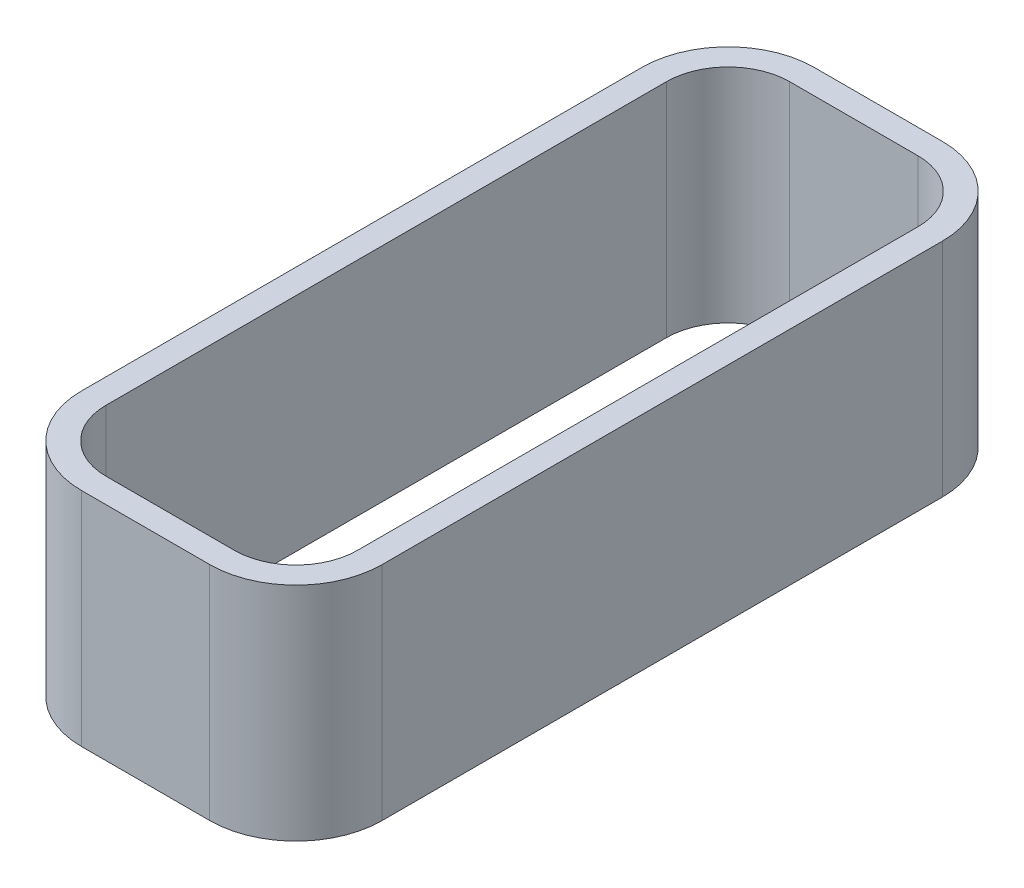
ISO-10303-21;
HEADER;
FILE_DESCRIPTION(('STEP AP214'),'2;1');
FILE_NAME('part.step','',(''),(''),'','','');
FILE_SCHEMA(('AUTOMOTIVE_DESIGN { 1 0 10303 214 1 1 1 1 }'));
ENDSEC;
DATA;
#1=APPLICATION_CONTEXT('core data for automotive mechanical design processes');
#2=APPLICATION_PROTOCOL_DEFINITION('international standard','automotive_design',2000,#1);
#3=PRODUCT_CONTEXT('',#1,'mechanical');
#4=PRODUCT('Part','Part','',(#3));
#5=PRODUCT_RELATED_PRODUCT_CATEGORY('part','',(#4));
#6=PRODUCT_DEFINITION_FORMATION('','',#4);
#7=PRODUCT_DEFINITION_CONTEXT('part definition',#1,'design');
#8=PRODUCT_DEFINITION('design','',#6,#7);
#9=PRODUCT_DEFINITION_SHAPE('','',#8);
#10=(LENGTH_UNIT() NAMED_UNIT(*) SI_UNIT(.MILLI.,.METRE.));
#11=(NAMED_UNIT(*) PLANE_ANGLE_UNIT() SI_UNIT($,.RADIAN.));
#12=(NAMED_UNIT(*) SI_UNIT($,.STERADIAN.) SOLID_ANGLE_UNIT());
#13=UNCERTAINTY_MEASURE_WITH_UNIT(LENGTH_MEASURE(1.E-05),#10,'distance_accuracy_value','');
#14=(GEOMETRIC_REPRESENTATION_CONTEXT(3) GLOBAL_UNCERTAINTY_ASSIGNED_CONTEXT((#13)) GLOBAL_UNIT_ASSIGNED_CONTEXT((#10,
#11,#12)) REPRESENTATION_CONTEXT('',''));
#15=CARTESIAN_POINT('',(0.,0.,0.));
#16=DIRECTION('',(0.,0.,1.));
#17=DIRECTION('',(1.,0.,0.));
#18=AXIS2_PLACEMENT_3D('',#15,#16,#17);
#19=CARTESIAN_POINT('',(-141.634040632791,2.4479314652041,-57.7658469617489));
#20=DIRECTION('',(-1.,0.,0.));
#21=DIRECTION('',(0.,0.,1.));
#22=AXIS2_PLACEMENT_3D('',#19,#20,#21);
#23=PLANE('',#22);
#24=DIRECTION('',(0.,0.,-1.));
#25=VECTOR('',#24,1.);
#26=CARTESIAN_POINT('',(-141.634040632791,-2.5520685347959,-58.7658469617489));
#27=LINE('',#26,#25);
#28=CARTESIAN_POINT('',(-141.634040632791,-2.5520685347959,-57.7658469617489));
#29=VERTEX_POINT('',#28);
#30=CARTESIAN_POINT('',(-141.634040632791,-2.5520685347959,-59.7658469617489));
#31=VERTEX_POINT('',#30);
#32=EDGE_CURVE('E258',#29,#31,#27,.T.);
#33=ORIENTED_EDGE('',*,*,#32,.F.);
#34=DIRECTION('',(0.,1.,0.));
#35=VECTOR('',#34,1.);
#36=CARTESIAN_POINT('',(-141.634040632791,2.4479314652041,-57.7658469617489));
#37=LINE('',#36,#35);
#38=CARTESIAN_POINT('',(-141.634040632791,-1.12418275469426,-57.7658469617489));
#39=VERTEX_POINT('',#38);
#40=EDGE_CURVE('E266',#39,#29,#37,.F.);
#41=ORIENTED_EDGE('',*,*,#40,.F.);
#42=DIRECTION('',(0.,0.,1.));
#43=VECTOR('',#42,1.);
#44=CARTESIAN_POINT('',(-141.634040632791,-1.12418275469427,-48.6733225165738));
#45=LINE('',#44,#43);
#46=CARTESIAN_POINT('',(-141.634040632791,-1.12418275469426,-59.7658469617489));
#47=VERTEX_POINT('',#46);
#48=EDGE_CURVE('E237',#39,#47,#45,.F.);
#49=ORIENTED_EDGE('',*,*,#48,.T.);
#50=DIRECTION('',(0.,1.,0.));
#51=VECTOR('',#50,1.);
#52=CARTESIAN_POINT('',(-141.634040632791,2.4479314652041,-59.7658469617489));
#53=LINE('',#52,#51);
#54=EDGE_CURVE('E252',#31,#47,#53,.T.);
#55=ORIENTED_EDGE('',*,*,#54,.F.);
#56=EDGE_LOOP('',(#33,#41,#49,#55));
#57=FACE_BOUND('',#56,.T.);
#58=ADVANCED_FACE('F17',(#57),#23,.T.);
#59=CARTESIAN_POINT('',(-141.634040632791,2.4479314652041,-48.6733225165738));
#60=DIRECTION('',(-1.,0.,0.));
#61=DIRECTION('',(0.,0.,1.));
#62=AXIS2_PLACEMENT_3D('',#59,#60,#61);
#63=PLANE('',#62);
#64=DIRECTION('',(0.,0.,-1.));
#65=VECTOR('',#64,1.);
#66=CARTESIAN_POINT('',(-141.634040632791,-2.5520685347959,-49.6733225165739));
#67=LINE('',#66,#65);
#68=CARTESIAN_POINT('',(-141.634040632791,-2.5520685347959,-48.6733225165738));
#69=VERTEX_POINT('',#68);
#70=CARTESIAN_POINT('',(-141.634040632791,-2.5520685347959,-50.6733225165738));
#71=VERTEX_POINT('',#70);
#72=EDGE_CURVE('E272',#69,#71,#67,.T.);
#73=ORIENTED_EDGE('',*,*,#72,.F.);
#74=DIRECTION('',(0.,1.,0.));
#75=VECTOR('',#74,1.);
#76=CARTESIAN_POINT('',(-141.634040632791,2.4479314652041,-48.6733225165738));
#77=LINE('',#76,#75);
#78=CARTESIAN_POINT('',(-141.634040632791,-1.12418275469426,-48.6733225165738));
#79=VERTEX_POINT('',#78);
#80=EDGE_CURVE('E284',#79,#69,#77,.F.);
#81=ORIENTED_EDGE('',*,*,#80,.F.);
#82=DIRECTION('',(0.,0.,1.));
#83=VECTOR('',#82,1.);
#84=CARTESIAN_POINT('',(-141.634040632791,-1.12418275469427,-48.6733225165738));
#85=LINE('',#84,#83);
#86=CARTESIAN_POINT('',(-141.634040632791,-1.12418275469426,-50.6733225165738));
#87=VERTEX_POINT('',#86);
#88=EDGE_CURVE('E208',#79,#87,#85,.F.);
#89=ORIENTED_EDGE('',*,*,#88,.T.);
#90=DIRECTION('',(0.,1.,0.));
#91=VECTOR('',#90,1.);
#92=CARTESIAN_POINT('',(-141.634040632791,2.4479314652041,-50.6733225165738));
#93=LINE('',#92,#91);
#94=EDGE_CURVE('E275',#71,#87,#93,.T.);
#95=ORIENTED_EDGE('',*,*,#94,.F.);
#96=EDGE_LOOP('',(#73,#81,#89,#95));
#97=FACE_BOUND('',#96,.T.);
#98=ADVANCED_FACE('F483',(#97),#63,.T.);
#99=CARTESIAN_POINT('',(-139.834040632791,2.4479314652041,-48.6733225165738));
#100=DIRECTION('',(0.,0.,1.));
#101=DIRECTION('',(1.,0.,0.));
#102=AXIS2_PLACEMENT_3D('',#99,#100,#101);
#103=PLANE('',#102);
#104=DIRECTION('',(1.,0.,0.));
#105=VECTOR('',#104,1.);
#106=CARTESIAN_POINT('',(-140.734040632791,-2.5520685347959,-48.6733225165738));
#107=LINE('',#106,#105);
#108=CARTESIAN_POINT('',(-139.834040602988,-2.5520685347959,-48.6733225165738));
#109=VERTEX_POINT('',#108);
#110=EDGE_CURVE('E278',#109,#69,#107,.F.);
#111=ORIENTED_EDGE('',*,*,#110,.F.);
#112=DIRECTION('',(0.,1.,0.));
#113=VECTOR('',#112,1.);
#114=CARTESIAN_POINT('',(-139.834040602988,-15.5520685347959,-48.6733225165738));
#115=LINE('',#114,#113);
#116=CARTESIAN_POINT('',(-139.83404062534,2.44793146520408,-48.6733225165738));
#117=VERTEX_POINT('',#116);
#118=EDGE_CURVE('E192',#117,#109,#115,.F.);
#119=ORIENTED_EDGE('',*,*,#118,.F.);
#120=DIRECTION('',(0.449999999999999,0.893028554974588,0.));
#121=VECTOR('',#120,1.);
#122=CARTESIAN_POINT('',(-139.834040632791,2.4479314652041,-48.6733225165738));
#123=LINE('',#122,#121);
#124=EDGE_CURVE('E202',#117,#79,#123,.F.);
#125=ORIENTED_EDGE('',*,*,#124,.T.);
#126=ORIENTED_EDGE('',*,*,#80,.T.);
#127=EDGE_LOOP('',(#111,#119,#125,#126));
#128=FACE_BOUND('',#127,.T.);
#129=ADVANCED_FACE('F488',(#128),#103,.T.);
#130=CARTESIAN_POINT('',(-140.734040632791,-2.5520685347959,-49.6733225165739));
#131=DIRECTION('',(0.,-1.,0.));
#132=DIRECTION('',(0.,0.,-1.));
#133=AXIS2_PLACEMENT_3D('',#130,#131,#132);
#134=PLANE('',#133);
#135=ORIENTED_EDGE('',*,*,#72,.T.);
#136=DIRECTION('',(-1.,0.,0.));
#137=VECTOR('',#136,1.);
#138=CARTESIAN_POINT('',(-141.634040632791,-2.5520685347959,-50.6733225165738));
#139=LINE('',#138,#137);
#140=CARTESIAN_POINT('',(-139.834040602988,-2.5520685347959,-50.6733225165738));
#141=VERTEX_POINT('',#140);
#142=EDGE_CURVE('E267',#141,#71,#139,.T.);
#143=ORIENTED_EDGE('',*,*,#142,.F.);
#144=DIRECTION('',(0.,0.,1.));
#145=VECTOR('',#144,1.);
#146=CARTESIAN_POINT('',(-139.834040602988,-2.5520685347959,-76.5168251656243));
#147=LINE('',#146,#145);
#148=EDGE_CURVE('E191',#109,#141,#147,.F.);
#149=ORIENTED_EDGE('',*,*,#148,.F.);
#150=ORIENTED_EDGE('',*,*,#110,.T.);
#151=EDGE_LOOP('',(#135,#143,#149,#150));
#152=FACE_BOUND('',#151,.T.);
#153=ADVANCED_FACE('F559',(#152),#134,.T.);
#154=CARTESIAN_POINT('',(-141.634040632791,2.4479314652041,-50.6733225165738));
#155=DIRECTION('',(0.,0.,-1.));
#156=DIRECTION('',(-1.,0.,0.));
#157=AXIS2_PLACEMENT_3D('',#154,#155,#156);
#158=PLANE('',#157);
#159=ORIENTED_EDGE('',*,*,#142,.T.);
#160=ORIENTED_EDGE('',*,*,#94,.T.);
#161=DIRECTION('',(0.449999999999999,0.893028554974588,0.));
#162=VECTOR('',#161,1.);
#163=CARTESIAN_POINT('',(-139.834040632791,2.4479314652041,-50.6733225165738));
#164=LINE('',#163,#162);
#165=CARTESIAN_POINT('',(-139.83404062534,2.44793146520409,-50.6733225165738));
#166=VERTEX_POINT('',#165);
#167=EDGE_CURVE('E193',#87,#166,#164,.T.);
#168=ORIENTED_EDGE('',*,*,#167,.T.);
#169=DIRECTION('',(0.,1.,0.));
#170=VECTOR('',#169,1.);
#171=CARTESIAN_POINT('',(-139.834040602988,-15.5520685347959,-50.6733225165738));
#172=LINE('',#171,#170);
#173=EDGE_CURVE('E222',#141,#166,#172,.T.);
#174=ORIENTED_EDGE('',*,*,#173,.F.);
#175=EDGE_LOOP('',(#159,#160,#168,#174));
#176=FACE_BOUND('',#175,.T.);
#177=ADVANCED_FACE('F454',(#176),#158,.T.);
#178=CARTESIAN_POINT('',(-139.834040632791,2.4479314652041,-57.7658469617489));
#179=DIRECTION('',(0.,0.,1.));
#180=DIRECTION('',(1.,0.,0.));
#181=AXIS2_PLACEMENT_3D('',#178,#179,#180);
#182=PLANE('',#181);
#183=DIRECTION('',(1.,0.,0.));
#184=VECTOR('',#183,1.);
#185=CARTESIAN_POINT('',(-140.734040632791,-2.5520685347959,-57.7658469617489));
#186=LINE('',#185,#184);
#187=CARTESIAN_POINT('',(-139.834040602988,-2.5520685347959,-57.7658469617489));
#188=VERTEX_POINT('',#187);
#189=EDGE_CURVE('E263',#188,#29,#186,.F.);
#190=ORIENTED_EDGE('',*,*,#189,.F.);
#191=DIRECTION('',(0.,1.,0.));
#192=VECTOR('',#191,1.);
#193=CARTESIAN_POINT('',(-139.834040602988,-15.5520685347959,-57.7658469617489));
#194=LINE('',#193,#192);
#195=CARTESIAN_POINT('',(-139.83404062534,2.44793146520408,-57.7658469617489));
#196=VERTEX_POINT('',#195);
#197=EDGE_CURVE('E221',#196,#188,#194,.F.);
#198=ORIENTED_EDGE('',*,*,#197,.F.);
#199=DIRECTION('',(0.449999999999999,0.893028554974588,0.));
#200=VECTOR('',#199,1.);
#201=CARTESIAN_POINT('',(-139.834040632791,2.4479314652041,-57.7658469617489));
#202=LINE('',#201,#200);
#203=EDGE_CURVE('E240',#196,#39,#202,.F.);
#204=ORIENTED_EDGE('',*,*,#203,.T.);
#205=ORIENTED_EDGE('',*,*,#40,.T.);
#206=EDGE_LOOP('',(#190,#198,#204,#205));
#207=FACE_BOUND('',#206,.T.);
#208=ADVANCED_FACE('F472',(#207),#182,.T.);
#209=CARTESIAN_POINT('',(-140.734040632791,-2.5520685347959,-58.7658469617489));
#210=DIRECTION('',(0.,-1.,0.));
#211=DIRECTION('',(0.,0.,-1.));
#212=AXIS2_PLACEMENT_3D('',#209,#210,#211);
#213=PLANE('',#212);
#214=ORIENTED_EDGE('',*,*,#189,.T.);
#215=ORIENTED_EDGE('',*,*,#32,.T.);
#216=DIRECTION('',(-1.,0.,0.));
#217=VECTOR('',#216,1.);
#218=CARTESIAN_POINT('',(-141.634040632791,-2.5520685347959,-59.7658469617489));
#219=LINE('',#218,#217);
#220=CARTESIAN_POINT('',(-139.834040602988,-2.5520685347959,-59.7658469617489));
#221=VERTEX_POINT('',#220);
#222=EDGE_CURVE('E251',#221,#31,#219,.T.);
#223=ORIENTED_EDGE('',*,*,#222,.F.);
#224=DIRECTION('',(0.,0.,1.));
#225=VECTOR('',#224,1.);
#226=CARTESIAN_POINT('',(-139.834040602988,-2.5520685347959,-76.5168251656243));
#227=LINE('',#226,#225);
#228=EDGE_CURVE('E228',#188,#221,#227,.F.);
#229=ORIENTED_EDGE('',*,*,#228,.F.);
#230=EDGE_LOOP('',(#214,#215,#223,#229));
#231=FACE_BOUND('',#230,.T.);
#232=ADVANCED_FACE('F480',(#231),#213,.T.);
#233=CARTESIAN_POINT('',(-141.634040632791,2.4479314652041,-59.7658469617489));
#234=DIRECTION('',(0.,0.,-1.));
#235=DIRECTION('',(-1.,0.,0.));
#236=AXIS2_PLACEMENT_3D('',#233,#234,#235);
#237=PLANE('',#236);
#238=ORIENTED_EDGE('',*,*,#222,.T.);
#239=ORIENTED_EDGE('',*,*,#54,.T.);
#240=DIRECTION('',(0.449999999999999,0.893028554974588,0.));
#241=VECTOR('',#240,1.);
#242=CARTESIAN_POINT('',(-139.834040632791,2.4479314652041,-59.7658469617489));
#243=LINE('',#242,#241);
#244=CARTESIAN_POINT('',(-139.83404062534,2.44793146520409,-59.7658469617489));
#245=VERTEX_POINT('',#244);
#246=EDGE_CURVE('E207',#47,#245,#243,.T.);
#247=ORIENTED_EDGE('',*,*,#246,.T.);
#248=DIRECTION('',(0.,1.,0.));
#249=VECTOR('',#248,1.);
#250=CARTESIAN_POINT('',(-139.834040602988,-15.5520685347959,-59.7658469617489));
#251=LINE('',#250,#249);
#252=EDGE_CURVE('E146',#221,#245,#251,.T.);
#253=ORIENTED_EDGE('',*,*,#252,.F.);
#254=EDGE_LOOP('',(#238,#239,#247,#253));
#255=FACE_BOUND('',#254,.T.);
#256=ADVANCED_FACE('F477',(#255),#237,.T.);
#257=CARTESIAN_POINT('',(-122.42396342386,-15.5520685347959,-76.5168251656243));
#258=DIRECTION('',(0.,1.,0.));
#259=DIRECTION('',(0.,0.,1.));
#260=AXIS2_PLACEMENT_3D('',#257,#258,#259);
#261=CYLINDRICAL_SURFACE('',#260,6.99999999999999);
#262=CARTESIAN_POINT('',(-122.42396342386,2.44793146520408,-76.5168251656243));
#263=DIRECTION('',(0.,1.,0.));
#264=DIRECTION('',(0.,0.,1.));
#265=AXIS2_PLACEMENT_3D('',#262,#263,#264);
#266=CIRCLE('',#265,6.99999999999999);
#267=CARTESIAN_POINT('',(-115.42396342386,2.44793146520408,-76.5168251656243));
#268=VERTEX_POINT('',#267);
#269=CARTESIAN_POINT('',(-122.42396342386,2.44793146520408,-83.5168251656243));
#270=VERTEX_POINT('',#269);
#271=EDGE_CURVE('E344',#268,#270,#266,.T.);
#272=ORIENTED_EDGE('',*,*,#271,.F.);
#273=DIRECTION('',(0.,1.,0.));
#274=VECTOR('',#273,1.);
#275=CARTESIAN_POINT('',(-115.42396342386,-15.5520685347959,-76.5168251656243));
#276=LINE('',#275,#274);
#277=CARTESIAN_POINT('',(-115.42396342386,-15.5520685347959,-76.5168251656243));
#278=VERTEX_POINT('',#277);
#279=EDGE_CURVE('E185',#278,#268,#276,.T.);
#280=ORIENTED_EDGE('',*,*,#279,.F.);
#281=CARTESIAN_POINT('',(-122.42396342386,-15.5520685347959,-76.5168251656243));
#282=DIRECTION('',(0.,1.,0.));
#283=DIRECTION('',(0.,0.,1.));
#284=AXIS2_PLACEMENT_3D('',#281,#282,#283);
#285=CIRCLE('',#284,6.99999999999999);
#286=CARTESIAN_POINT('',(-122.42396342386,-15.5520685347959,-83.5168251656243));
#287=VERTEX_POINT('',#286);
#288=EDGE_CURVE('E357',#278,#287,#285,.T.);
#289=ORIENTED_EDGE('',*,*,#288,.T.);
#290=DIRECTION('',(0.,1.,0.));
#291=VECTOR('',#290,1.);
#292=CARTESIAN_POINT('',(-122.42396342386,-15.5520685347959,-83.5168251656243));
#293=LINE('',#292,#291);
#294=EDGE_CURVE('E248',#270,#287,#293,.F.);
#295=ORIENTED_EDGE('',*,*,#294,.F.);
#296=EDGE_LOOP('',(#272,#280,#289,#295));
#297=FACE_BOUND('',#296,.T.);
#298=ADVANCED_FACE('F546',(#297),#261,.T.);
#299=CARTESIAN_POINT('',(-122.42396342386,-15.5520685347959,-83.5168251656243));
#300=DIRECTION('',(0.,0.,-1.));
#301=DIRECTION('',(-1.,0.,0.));
#302=AXIS2_PLACEMENT_3D('',#299,#300,#301);
#303=PLANE('',#302);
#304=DIRECTION('',(1.,0.,0.));
#305=VECTOR('',#304,1.);
#306=CARTESIAN_POINT('',(-127.629002013424,2.44793146520408,-83.5168251656243));
#307=LINE('',#306,#305);
#308=CARTESIAN_POINT('',(-132.834040602988,2.44793146520408,-83.5168251656243));
#309=VERTEX_POINT('',#308);
#310=EDGE_CURVE('E342',#270,#309,#307,.F.);
#311=ORIENTED_EDGE('',*,*,#310,.F.);
#312=ORIENTED_EDGE('',*,*,#294,.T.);
#313=DIRECTION('',(1.,0.,0.));
#314=VECTOR('',#313,1.);
#315=CARTESIAN_POINT('',(-127.629002013424,-15.5520685347959,-83.5168251656243));
#316=LINE('',#315,#314);
#317=CARTESIAN_POINT('',(-132.834040602988,-15.5520685347959,-83.5168251656243));
#318=VERTEX_POINT('',#317);
#319=EDGE_CURVE('E130',#287,#318,#316,.F.);
#320=ORIENTED_EDGE('',*,*,#319,.T.);
#321=DIRECTION('',(0.,1.,0.));
#322=VECTOR('',#321,1.);
#323=CARTESIAN_POINT('',(-132.834040602988,-15.5520685347959,-83.5168251656243));
#324=LINE('',#323,#322);
#325=EDGE_CURVE('E137',#309,#318,#324,.F.);
#326=ORIENTED_EDGE('',*,*,#325,.F.);
#327=EDGE_LOOP('',(#311,#312,#320,#326));
#328=FACE_BOUND('',#327,.T.);
#329=ADVANCED_FACE('F543',(#328),#303,.T.);
#330=CARTESIAN_POINT('',(-132.834040602988,-15.5520685347959,-76.5168251656243));
#331=DIRECTION('',(0.,1.,0.));
#332=DIRECTION('',(0.,0.,1.));
#333=AXIS2_PLACEMENT_3D('',#330,#331,#332);
#334=CYLINDRICAL_SURFACE('',#333,6.99999999999999);
#335=CARTESIAN_POINT('',(-132.834040602988,2.44793146520408,-76.5168251656243));
#336=DIRECTION('',(0.,1.,0.));
#337=DIRECTION('',(0.,0.,1.));
#338=AXIS2_PLACEMENT_3D('',#335,#336,#337);
#339=CIRCLE('',#338,6.99999999999999);
#340=CARTESIAN_POINT('',(-139.834040602988,2.44793146520408,-76.5168251656243));
#341=VERTEX_POINT('',#340);
#342=EDGE_CURVE('E345',#309,#341,#339,.T.);
#343=ORIENTED_EDGE('',*,*,#342,.F.);
#344=ORIENTED_EDGE('',*,*,#325,.T.);
#345=CARTESIAN_POINT('',(-132.834040602988,-15.5520685347959,-76.5168251656243));
#346=DIRECTION('',(0.,1.,0.));
#347=DIRECTION('',(0.,0.,1.));
#348=AXIS2_PLACEMENT_3D('',#345,#346,#347);
#349=CIRCLE('',#348,6.99999999999999);
#350=CARTESIAN_POINT('',(-139.834040602988,-15.5520685347959,-76.5168251656243));
#351=VERTEX_POINT('',#350);
#352=EDGE_CURVE('E20',#318,#351,#349,.T.);
#353=ORIENTED_EDGE('',*,*,#352,.T.);
#354=DIRECTION('',(0.,1.,0.));
#355=VECTOR('',#354,1.);
#356=CARTESIAN_POINT('',(-139.834040602988,-15.5520685347959,-76.5168251656243));
#357=LINE('',#356,#355);
#358=EDGE_CURVE('E133',#341,#351,#357,.F.);
#359=ORIENTED_EDGE('',*,*,#358,.F.);
#360=EDGE_LOOP('',(#343,#344,#353,#359));
#361=FACE_BOUND('',#360,.T.);
#362=ADVANCED_FACE('F132',(#361),#334,.T.);
#363=CARTESIAN_POINT('',(-139.834040632791,2.4479314652041,-48.6733225165738));
#364=DIRECTION('',(0.893028554974588,-0.449999999999999,0.));
#365=DIRECTION('',(0.449999999999999,0.893028554974588,0.));
#366=AXIS2_PLACEMENT_3D('',#363,#364,#365);
#367=PLANE('',#366);
#368=ORIENTED_EDGE('',*,*,#48,.F.);
#369=ORIENTED_EDGE('',*,*,#203,.F.);
#370=DIRECTION('',(0.,0.,1.));
#371=VECTOR('',#370,1.);
#372=CARTESIAN_POINT('',(-139.834040632791,2.44793146520408,-53.7716532739574));
#373=LINE('',#372,#371);
#374=EDGE_CURVE('E217',#245,#196,#373,.T.);
#375=ORIENTED_EDGE('',*,*,#374,.F.);
#376=ORIENTED_EDGE('',*,*,#246,.F.);
#377=EDGE_LOOP('',(#368,#369,#375,#376));
#378=FACE_BOUND('',#377,.T.);
#379=ADVANCED_FACE('F468',(#378),#367,.F.);
#380=CARTESIAN_POINT('',(-139.834040632791,2.4479314652041,-48.6733225165738));
#381=DIRECTION('',(0.893028554974588,-0.449999999999999,0.));
#382=DIRECTION('',(0.449999999999999,0.893028554974588,0.));
#383=AXIS2_PLACEMENT_3D('',#380,#381,#382);
#384=PLANE('',#383);
#385=ORIENTED_EDGE('',*,*,#88,.F.);
#386=ORIENTED_EDGE('',*,*,#124,.F.);
#387=DIRECTION('',(0.,0.,1.));
#388=VECTOR('',#387,1.);
#389=CARTESIAN_POINT('',(-139.834040632791,2.44793146520408,-53.7716532739574));
#390=LINE('',#389,#388);
#391=EDGE_CURVE('E196',#166,#117,#390,.T.);
#392=ORIENTED_EDGE('',*,*,#391,.F.);
#393=ORIENTED_EDGE('',*,*,#167,.F.);
#394=EDGE_LOOP('',(#385,#386,#392,#393));
#395=FACE_BOUND('',#394,.T.);
#396=ADVANCED_FACE('F462',(#395),#384,.F.);
#397=CARTESIAN_POINT('',(-139.834040602988,-15.5520685347959,-76.5168251656243));
#398=DIRECTION('',(-1.,0.,0.));
#399=DIRECTION('',(0.,0.,1.));
#400=AXIS2_PLACEMENT_3D('',#397,#398,#399);
#401=PLANE('',#400);
#402=DIRECTION('',(0.,1.,0.));
#403=VECTOR('',#402,1.);
#404=CARTESIAN_POINT('',(-139.834040602988,-15.5520685347959,-31.0264813822906));
#405=LINE('',#404,#403);
#406=CARTESIAN_POINT('',(-139.834040617889,2.44793146520408,-31.0264813822906));
#407=VERTEX_POINT('',#406);
#408=CARTESIAN_POINT('',(-139.834040602988,-15.5520685347959,-31.0264813822906));
#409=VERTEX_POINT('',#408);
#410=EDGE_CURVE('E150',#407,#409,#405,.F.);
#411=ORIENTED_EDGE('',*,*,#410,.F.);
#412=DIRECTION('',(0.,0.,1.));
#413=VECTOR('',#412,1.);
#414=CARTESIAN_POINT('',(-139.834040632791,2.44793146520408,-53.7716532739574));
#415=LINE('',#414,#413);
#416=EDGE_CURVE('E203',#117,#407,#415,.T.);
#417=ORIENTED_EDGE('',*,*,#416,.F.);
#418=ORIENTED_EDGE('',*,*,#118,.T.);
#419=ORIENTED_EDGE('',*,*,#148,.T.);
#420=ORIENTED_EDGE('',*,*,#173,.T.);
#421=DIRECTION('',(0.,0.,1.));
#422=VECTOR('',#421,1.);
#423=CARTESIAN_POINT('',(-139.834040632791,2.44793146520408,-53.7716532739574));
#424=LINE('',#423,#422);
#425=EDGE_CURVE('E205',#196,#166,#424,.T.);
#426=ORIENTED_EDGE('',*,*,#425,.F.);
#427=ORIENTED_EDGE('',*,*,#197,.T.);
#428=ORIENTED_EDGE('',*,*,#228,.T.);
#429=ORIENTED_EDGE('',*,*,#252,.T.);
#430=DIRECTION('',(0.,0.,1.));
#431=VECTOR('',#430,1.);
#432=CARTESIAN_POINT('',(-139.834040602988,2.44793146520408,-53.7716532739574));
#433=LINE('',#432,#431);
#434=EDGE_CURVE('E144',#341,#245,#433,.T.);
#435=ORIENTED_EDGE('',*,*,#434,.F.);
#436=ORIENTED_EDGE('',*,*,#358,.T.);
#437=DIRECTION('',(0.,0.,1.));
#438=VECTOR('',#437,1.);
#439=CARTESIAN_POINT('',(-139.834040602988,-15.5520685347959,-53.7716532739574));
#440=LINE('',#439,#438);
#441=EDGE_CURVE('E136',#351,#409,#440,.T.);
#442=ORIENTED_EDGE('',*,*,#441,.T.);
#443=EDGE_LOOP('',(#411,#417,#418,#419,#420,#426,#427,#428,#429,#435,#436,#442));
#444=FACE_BOUND('',#443,.T.);
#445=ADVANCED_FACE('F143',(#444),#401,.T.);
#446=CARTESIAN_POINT('',(-132.834040602988,-15.5520685347959,-31.0264813822906));
#447=DIRECTION('',(0.,1.,0.));
#448=DIRECTION('',(0.,0.,1.));
#449=AXIS2_PLACEMENT_3D('',#446,#447,#448);
#450=CYLINDRICAL_SURFACE('',#449,6.99999999999999);
#451=CARTESIAN_POINT('',(-132.834040602988,2.44793146520408,-31.0264813822906));
#452=DIRECTION('',(0.,1.,0.));
#453=DIRECTION('',(0.,0.,1.));
#454=AXIS2_PLACEMENT_3D('',#451,#452,#453);
#455=CIRCLE('',#454,6.99999999999999);
#456=CARTESIAN_POINT('',(-132.834040602988,2.44793146520408,-24.0264813822906));
#457=VERTEX_POINT('',#456);
#458=EDGE_CURVE('E338',#407,#457,#455,.T.);
#459=ORIENTED_EDGE('',*,*,#458,.F.);
#460=ORIENTED_EDGE('',*,*,#410,.T.);
#461=CARTESIAN_POINT('',(-132.834040602988,-15.5520685347959,-31.0264813822906));
#462=DIRECTION('',(0.,1.,0.));
#463=DIRECTION('',(0.,0.,1.));
#464=AXIS2_PLACEMENT_3D('',#461,#462,#463);
#465=CIRCLE('',#464,6.99999999999999);
#466=CARTESIAN_POINT('',(-132.834040602988,-15.5520685347959,-24.0264813822906));
#467=VERTEX_POINT('',#466);
#468=EDGE_CURVE('E152',#409,#467,#465,.T.);
#469=ORIENTED_EDGE('',*,*,#468,.T.);
#470=DIRECTION('',(0.,1.,0.));
#471=VECTOR('',#470,1.);
#472=CARTESIAN_POINT('',(-132.834040602988,-15.5520685347959,-24.0264813822906));
#473=LINE('',#472,#471);
#474=EDGE_CURVE('E190',#457,#467,#473,.F.);
#475=ORIENTED_EDGE('',*,*,#474,.F.);
#476=EDGE_LOOP('',(#459,#460,#469,#475));
#477=FACE_BOUND('',#476,.T.);
#478=ADVANCED_FACE('F533',(#477),#450,.T.);
#479=CARTESIAN_POINT('',(-132.834040602988,-15.5520685347959,-24.0264813822906));
#480=DIRECTION('',(0.,0.,1.));
#481=DIRECTION('',(1.,0.,0.));
#482=AXIS2_PLACEMENT_3D('',#479,#480,#481);
#483=PLANE('',#482);
#484=DIRECTION('',(1.,0.,0.));
#485=VECTOR('',#484,1.);
#486=CARTESIAN_POINT('',(-127.629002013424,2.44793146520408,-24.0264813822906));
#487=LINE('',#486,#485);
#488=CARTESIAN_POINT('',(-122.42396342386,2.44793146520408,-24.0264813822906));
#489=VERTEX_POINT('',#488);
#490=EDGE_CURVE('E339',#457,#489,#487,.T.);
#491=ORIENTED_EDGE('',*,*,#490,.F.);
#492=ORIENTED_EDGE('',*,*,#474,.T.);
#493=DIRECTION('',(1.,0.,0.));
#494=VECTOR('',#493,1.);
#495=CARTESIAN_POINT('',(-127.629002013424,-15.5520685347959,-24.0264813822906));
#496=LINE('',#495,#494);
#497=CARTESIAN_POINT('',(-122.42396342386,-15.5520685347959,-24.0264813822906));
#498=VERTEX_POINT('',#497);
#499=EDGE_CURVE('E156',#467,#498,#496,.T.);
#500=ORIENTED_EDGE('',*,*,#499,.T.);
#501=DIRECTION('',(0.,1.,0.));
#502=VECTOR('',#501,1.);
#503=CARTESIAN_POINT('',(-122.42396342386,-15.5520685347959,-24.0264813822906));
#504=LINE('',#503,#502);
#505=EDGE_CURVE('E182',#489,#498,#504,.F.);
#506=ORIENTED_EDGE('',*,*,#505,.F.);
#507=EDGE_LOOP('',(#491,#492,#500,#506));
#508=FACE_BOUND('',#507,.T.);
#509=ADVANCED_FACE('F368',(#508),#483,.T.);
#510=CARTESIAN_POINT('',(-122.42396342386,-15.5520685347959,-31.0264813822906));
#511=DIRECTION('',(0.,1.,0.));
#512=DIRECTION('',(0.,0.,1.));
#513=AXIS2_PLACEMENT_3D('',#510,#511,#512);
#514=CYLINDRICAL_SURFACE('',#513,7.);
#515=CARTESIAN_POINT('',(-122.42396342386,2.44793146520408,-31.0264813822906));
#516=DIRECTION('',(0.,1.,0.));
#517=DIRECTION('',(0.,0.,1.));
#518=AXIS2_PLACEMENT_3D('',#515,#516,#517);
#519=CIRCLE('',#518,7.);
#520=CARTESIAN_POINT('',(-115.42396342386,2.44793146520408,-31.0264813822906));
#521=VERTEX_POINT('',#520);
#522=EDGE_CURVE('E331',#489,#521,#519,.T.);
#523=ORIENTED_EDGE('',*,*,#522,.F.);
#524=ORIENTED_EDGE('',*,*,#505,.T.);
#525=CARTESIAN_POINT('',(-122.42396342386,-15.5520685347959,-31.0264813822906));
#526=DIRECTION('',(0.,1.,0.));
#527=DIRECTION('',(0.,0.,1.));
#528=AXIS2_PLACEMENT_3D('',#525,#526,#527);
#529=CIRCLE('',#528,7.);
#530=CARTESIAN_POINT('',(-115.42396342386,-15.5520685347959,-31.0264813822906));
#531=VERTEX_POINT('',#530);
#532=EDGE_CURVE('E358',#498,#531,#529,.T.);
#533=ORIENTED_EDGE('',*,*,#532,.T.);
#534=DIRECTION('',(0.,1.,0.));
#535=VECTOR('',#534,1.);
#536=CARTESIAN_POINT('',(-115.42396342386,-15.5520685347959,-31.0264813822906));
#537=LINE('',#536,#535);
#538=EDGE_CURVE('E178',#521,#531,#537,.F.);
#539=ORIENTED_EDGE('',*,*,#538,.F.);
#540=EDGE_LOOP('',(#523,#524,#533,#539));
#541=FACE_BOUND('',#540,.T.);
#542=ADVANCED_FACE('F366',(#541),#514,.T.);
#543=CARTESIAN_POINT('',(-115.42396342386,-15.5520685347959,-31.0264813822906));
#544=DIRECTION('',(1.,0.,0.));
#545=DIRECTION('',(0.,0.,-1.));
#546=AXIS2_PLACEMENT_3D('',#543,#544,#545);
#547=PLANE('',#546);
#548=DIRECTION('',(0.,0.,1.));
#549=VECTOR('',#548,1.);
#550=CARTESIAN_POINT('',(-115.42396342386,2.44793146520408,-53.7716532739574));
#551=LINE('',#550,#549);
#552=EDGE_CURVE('E337',#521,#268,#551,.F.);
#553=ORIENTED_EDGE('',*,*,#552,.F.);
#554=ORIENTED_EDGE('',*,*,#538,.T.);
#555=DIRECTION('',(0.,0.,1.));
#556=VECTOR('',#555,1.);
#557=CARTESIAN_POINT('',(-115.42396342386,-15.5520685347959,-53.7716532739574));
#558=LINE('',#557,#556);
#559=EDGE_CURVE('E356',#531,#278,#558,.F.);
#560=ORIENTED_EDGE('',*,*,#559,.T.);
#561=ORIENTED_EDGE('',*,*,#279,.T.);
#562=EDGE_LOOP('',(#553,#554,#560,#561));
#563=FACE_BOUND('',#562,.T.);
#564=ADVANCED_FACE('F373',(#563),#547,.T.);
#565=CARTESIAN_POINT('',(-117.42396342386,-15.5520685347959,-76.5168251656243));
#566=DIRECTION('',(-1.,0.,0.));
#567=DIRECTION('',(0.,0.,1.));
#568=AXIS2_PLACEMENT_3D('',#565,#566,#567);
#569=PLANE('',#568);
#570=DIRECTION('',(0.,0.,1.));
#571=VECTOR('',#570,1.);
#572=CARTESIAN_POINT('',(-117.42396342386,2.44793146520408,-53.7716532739574));
#573=LINE('',#572,#571);
#574=CARTESIAN_POINT('',(-117.42396342386,2.44793146520408,-76.5168251656243));
#575=VERTEX_POINT('',#574);
#576=CARTESIAN_POINT('',(-117.42396342386,2.44793146520408,-31.0264813822906));
#577=VERTEX_POINT('',#576);
#578=EDGE_CURVE('E334',#575,#577,#573,.T.);
#579=ORIENTED_EDGE('',*,*,#578,.F.);
#580=DIRECTION('',(0.,1.,0.));
#581=VECTOR('',#580,1.);
#582=CARTESIAN_POINT('',(-117.42396342386,-15.5520685347959,-76.5168251656243));
#583=LINE('',#582,#581);
#584=CARTESIAN_POINT('',(-117.42396342386,-15.5520685347959,-76.5168251656243));
#585=VERTEX_POINT('',#584);
#586=EDGE_CURVE('E169',#575,#585,#583,.F.);
#587=ORIENTED_EDGE('',*,*,#586,.T.);
#588=DIRECTION('',(0.,0.,1.));
#589=VECTOR('',#588,1.);
#590=CARTESIAN_POINT('',(-117.42396342386,-15.5520685347959,-53.7716532739574));
#591=LINE('',#590,#589);
#592=CARTESIAN_POINT('',(-117.42396342386,-15.5520685347959,-31.0264813822906));
#593=VERTEX_POINT('',#592);
#594=EDGE_CURVE('E173',#585,#593,#591,.T.);
#595=ORIENTED_EDGE('',*,*,#594,.T.);
#596=DIRECTION('',(0.,1.,0.));
#597=VECTOR('',#596,1.);
#598=CARTESIAN_POINT('',(-117.42396342386,-15.5520685347959,-31.0264813822906));
#599=LINE('',#598,#597);
#600=EDGE_CURVE('E166',#593,#577,#599,.T.);
#601=ORIENTED_EDGE('',*,*,#600,.T.);
#602=EDGE_LOOP('',(#579,#587,#595,#601));
#603=FACE_BOUND('',#602,.T.);
#604=ADVANCED_FACE('F519',(#603),#569,.T.);
#605=CARTESIAN_POINT('',(-122.42396342386,-15.5520685347959,-31.0264813822906));
#606=DIRECTION('',(0.,1.,0.));
#607=DIRECTION('',(0.,0.,1.));
#608=AXIS2_PLACEMENT_3D('',#605,#606,#607);
#609=CYLINDRICAL_SURFACE('',#608,5.);
#610=DIRECTION('',(0.,1.,0.));
#611=VECTOR('',#610,1.);
#612=CARTESIAN_POINT('',(-122.42396342386,-15.5520685347959,-26.0264813822906));
#613=LINE('',#612,#611);
#614=CARTESIAN_POINT('',(-122.42396342386,2.44793146520408,-26.0264813822906));
#615=VERTEX_POINT('',#614);
#616=CARTESIAN_POINT('',(-122.42396342386,-15.5520685347959,-26.0264813822906));
#617=VERTEX_POINT('',#616);
#618=EDGE_CURVE('E161',#615,#617,#613,.F.);
#619=ORIENTED_EDGE('',*,*,#618,.F.);
#620=CARTESIAN_POINT('',(-122.42396342386,2.44793146520408,-31.0264813822906));
#621=DIRECTION('',(0.,1.,0.));
#622=DIRECTION('',(0.,0.,1.));
#623=AXIS2_PLACEMENT_3D('',#620,#621,#622);
#624=CIRCLE('',#623,5.);
#625=EDGE_CURVE('E329',#577,#615,#624,.F.);
#626=ORIENTED_EDGE('',*,*,#625,.F.);
#627=ORIENTED_EDGE('',*,*,#600,.F.);
#628=CARTESIAN_POINT('',(-122.42396342386,-15.5520685347959,-31.0264813822906));
#629=DIRECTION('',(0.,1.,0.));
#630=DIRECTION('',(0.,0.,1.));
#631=AXIS2_PLACEMENT_3D('',#628,#629,#630);
#632=CIRCLE('',#631,5.);
#633=EDGE_CURVE('E352',#593,#617,#632,.F.);
#634=ORIENTED_EDGE('',*,*,#633,.T.);
#635=EDGE_LOOP('',(#619,#626,#627,#634));
#636=FACE_BOUND('',#635,.T.);
#637=ADVANCED_FACE('F516',(#636),#609,.F.);
#638=CARTESIAN_POINT('',(-132.834040602988,-15.5520685347959,-81.5168251656243));
#639=DIRECTION('',(0.,0.,1.));
#640=DIRECTION('',(1.,0.,0.));
#641=AXIS2_PLACEMENT_3D('',#638,#639,#640);
#642=PLANE('',#641);
#643=DIRECTION('',(1.,0.,0.));
#644=VECTOR('',#643,1.);
#645=CARTESIAN_POINT('',(-127.629002013424,2.44793146520408,-81.5168251656243));
#646=LINE('',#645,#644);
#647=CARTESIAN_POINT('',(-132.834040602988,2.44793146520408,-81.5168251656243));
#648=VERTEX_POINT('',#647);
#649=CARTESIAN_POINT('',(-122.42396342386,2.44793146520408,-81.5168251656243));
#650=VERTEX_POINT('',#649);
#651=EDGE_CURVE('E324',#648,#650,#646,.T.);
#652=ORIENTED_EDGE('',*,*,#651,.F.);
#653=DIRECTION('',(0.,1.,0.));
#654=VECTOR('',#653,1.);
#655=CARTESIAN_POINT('',(-132.834040602988,-15.5520685347959,-81.5168251656243));
#656=LINE('',#655,#654);
#657=CARTESIAN_POINT('',(-132.834040602988,-15.5520685347959,-81.5168251656243));
#658=VERTEX_POINT('',#657);
#659=EDGE_CURVE('E171',#648,#658,#656,.F.);
#660=ORIENTED_EDGE('',*,*,#659,.T.);
#661=DIRECTION('',(1.,0.,0.));
#662=VECTOR('',#661,1.);
#663=CARTESIAN_POINT('',(-127.629002013424,-15.5520685347959,-81.5168251656243));
#664=LINE('',#663,#662);
#665=CARTESIAN_POINT('',(-122.42396342386,-15.5520685347959,-81.5168251656243));
#666=VERTEX_POINT('',#665);
#667=EDGE_CURVE('E355',#658,#666,#664,.T.);
#668=ORIENTED_EDGE('',*,*,#667,.T.);
#669=DIRECTION('',(0.,1.,0.));
#670=VECTOR('',#669,1.);
#671=CARTESIAN_POINT('',(-122.42396342386,-15.5520685347959,-81.5168251656243));
#672=LINE('',#671,#670);
#673=EDGE_CURVE('E167',#666,#650,#672,.T.);
#674=ORIENTED_EDGE('',*,*,#673,.T.);
#675=EDGE_LOOP('',(#652,#660,#668,#674));
#676=FACE_BOUND('',#675,.T.);
#677=ADVANCED_FACE('F511',(#676),#642,.T.);
#678=CARTESIAN_POINT('',(-122.42396342386,-15.5520685347959,-76.5168251656243));
#679=DIRECTION('',(0.,1.,0.));
#680=DIRECTION('',(0.,0.,1.));
#681=AXIS2_PLACEMENT_3D('',#678,#679,#680);
#682=CYLINDRICAL_SURFACE('',#681,5.);
#683=ORIENTED_EDGE('',*,*,#586,.F.);
#684=CARTESIAN_POINT('',(-122.42396342386,2.44793146520408,-76.5168251656243));
#685=DIRECTION('',(0.,1.,0.));
#686=DIRECTION('',(0.,0.,1.));
#687=AXIS2_PLACEMENT_3D('',#684,#685,#686);
#688=CIRCLE('',#687,5.);
#689=EDGE_CURVE('E164',#650,#575,#688,.F.);
#690=ORIENTED_EDGE('',*,*,#689,.F.);
#691=ORIENTED_EDGE('',*,*,#673,.F.);
#692=CARTESIAN_POINT('',(-122.42396342386,-15.5520685347959,-76.5168251656243));
#693=DIRECTION('',(0.,1.,0.));
#694=DIRECTION('',(0.,0.,1.));
#695=AXIS2_PLACEMENT_3D('',#692,#693,#694);
#696=CIRCLE('',#695,5.);
#697=EDGE_CURVE('E347',#666,#585,#696,.F.);
#698=ORIENTED_EDGE('',*,*,#697,.T.);
#699=EDGE_LOOP('',(#683,#690,#691,#698));
#700=FACE_BOUND('',#699,.T.);
#701=ADVANCED_FACE('F507',(#700),#682,.F.);
#702=CARTESIAN_POINT('',(-122.42396342386,-15.5520685347959,-26.0264813822906));
#703=DIRECTION('',(0.,0.,-1.));
#704=DIRECTION('',(-1.,0.,0.));
#705=AXIS2_PLACEMENT_3D('',#702,#703,#704);
#706=PLANE('',#705);
#707=DIRECTION('',(1.,0.,0.));
#708=VECTOR('',#707,1.);
#709=CARTESIAN_POINT('',(-127.629002013424,2.44793146520408,-26.0264813822906));
#710=LINE('',#709,#708);
#711=CARTESIAN_POINT('',(-132.834040602988,2.44793146520408,-26.0264813822906));
#712=VERTEX_POINT('',#711);
#713=EDGE_CURVE('E328',#615,#712,#710,.F.);
#714=ORIENTED_EDGE('',*,*,#713,.F.);
#715=ORIENTED_EDGE('',*,*,#618,.T.);
#716=DIRECTION('',(1.,0.,0.));
#717=VECTOR('',#716,1.);
#718=CARTESIAN_POINT('',(-127.629002013424,-15.5520685347959,-26.0264813822906));
#719=LINE('',#718,#717);
#720=CARTESIAN_POINT('',(-132.834040602988,-15.5520685347959,-26.0264813822906));
#721=VERTEX_POINT('',#720);
#722=EDGE_CURVE('E354',#617,#721,#719,.F.);
#723=ORIENTED_EDGE('',*,*,#722,.T.);
#724=DIRECTION('',(0.,1.,0.));
#725=VECTOR('',#724,1.);
#726=CARTESIAN_POINT('',(-132.834040602988,-15.5520685347959,-26.0264813822906));
#727=LINE('',#726,#725);
#728=EDGE_CURVE('E165',#721,#712,#727,.T.);
#729=ORIENTED_EDGE('',*,*,#728,.T.);
#730=EDGE_LOOP('',(#714,#715,#723,#729));
#731=FACE_BOUND('',#730,.T.);
#732=ADVANCED_FACE('F404',(#731),#706,.T.);
#733=CARTESIAN_POINT('',(-127.629002013424,-15.5520685347959,-53.7716532739574));
#734=DIRECTION('',(0.,1.,0.));
#735=DIRECTION('',(0.,0.,1.));
#736=AXIS2_PLACEMENT_3D('',#733,#734,#735);
#737=PLANE('',#736);
#738=ORIENTED_EDGE('',*,*,#697,.F.);
#739=ORIENTED_EDGE('',*,*,#667,.F.);
#740=CARTESIAN_POINT('',(-132.834040602988,-15.5520685347959,-76.5168251656243));
#741=DIRECTION('',(0.,1.,0.));
#742=DIRECTION('',(0.,0.,1.));
#743=AXIS2_PLACEMENT_3D('',#740,#741,#742);
#744=CIRCLE('',#743,5.);
#745=CARTESIAN_POINT('',(-137.834040602988,-15.5520685347959,-76.5168251656243));
#746=VERTEX_POINT('',#745);
#747=EDGE_CURVE('E174',#658,#746,#744,.T.);
#748=ORIENTED_EDGE('',*,*,#747,.T.);
#749=DIRECTION('',(0.,0.,-1.));
#750=VECTOR('',#749,1.);
#751=CARTESIAN_POINT('',(-137.834040602988,-15.5520685347959,-31.0264813822906));
#752=LINE('',#751,#750);
#753=CARTESIAN_POINT('',(-137.834040602988,-15.5520685347959,-31.0264813822906));
#754=VERTEX_POINT('',#753);
#755=EDGE_CURVE('E321',#754,#746,#752,.T.);
#756=ORIENTED_EDGE('',*,*,#755,.F.);
#757=CARTESIAN_POINT('',(-132.834040602988,-15.5520685347959,-31.0264813822906));
#758=DIRECTION('',(0.,1.,0.));
#759=DIRECTION('',(0.,0.,1.));
#760=AXIS2_PLACEMENT_3D('',#757,#758,#759);
#761=CIRCLE('',#760,5.);
#762=EDGE_CURVE('E318',#754,#721,#761,.T.);
#763=ORIENTED_EDGE('',*,*,#762,.T.);
#764=ORIENTED_EDGE('',*,*,#722,.F.);
#765=ORIENTED_EDGE('',*,*,#633,.F.);
#766=ORIENTED_EDGE('',*,*,#594,.F.);
#767=EDGE_LOOP('',(#738,#739,#748,#756,#763,#764,#765,#766));
#768=FACE_BOUND('',#767,.T.);
#769=ORIENTED_EDGE('',*,*,#559,.F.);
#770=ORIENTED_EDGE('',*,*,#532,.F.);
#771=ORIENTED_EDGE('',*,*,#499,.F.);
#772=ORIENTED_EDGE('',*,*,#468,.F.);
#773=ORIENTED_EDGE('',*,*,#441,.F.);
#774=ORIENTED_EDGE('',*,*,#352,.F.);
#775=ORIENTED_EDGE('',*,*,#319,.F.);
#776=ORIENTED_EDGE('',*,*,#288,.F.);
#777=EDGE_LOOP('',(#769,#770,#771,#772,#773,#774,#775,#776));
#778=FACE_BOUND('',#777,.T.);
#779=ADVANCED_FACE('F155',(#768,#778),#737,.F.);
#780=CARTESIAN_POINT('',(-132.834040602988,-15.5520685347959,-76.5168251656243));
#781=DIRECTION('',(0.,1.,0.));
#782=DIRECTION('',(0.,0.,1.));
#783=AXIS2_PLACEMENT_3D('',#780,#781,#782);
#784=CYLINDRICAL_SURFACE('',#783,5.);
#785=ORIENTED_EDGE('',*,*,#659,.F.);
#786=CARTESIAN_POINT('',(-132.834040602988,2.44793146520408,-76.5168251656243));
#787=DIRECTION('',(0.,1.,0.));
#788=DIRECTION('',(0.,0.,1.));
#789=AXIS2_PLACEMENT_3D('',#786,#787,#788);
#790=CIRCLE('',#789,5.);
#791=CARTESIAN_POINT('',(-137.834040602988,2.44793146520408,-76.5168251656243));
#792=VERTEX_POINT('',#791);
#793=EDGE_CURVE('E326',#792,#648,#790,.F.);
#794=ORIENTED_EDGE('',*,*,#793,.F.);
#795=DIRECTION('',(0.,1.,0.));
#796=VECTOR('',#795,1.);
#797=CARTESIAN_POINT('',(-137.834040602988,-15.5520685347959,-76.5168251656243));
#798=LINE('',#797,#796);
#799=EDGE_CURVE('E391',#746,#792,#798,.T.);
#800=ORIENTED_EDGE('',*,*,#799,.F.);
#801=ORIENTED_EDGE('',*,*,#747,.F.);
#802=EDGE_LOOP('',(#785,#794,#800,#801));
#803=FACE_BOUND('',#802,.T.);
#804=ADVANCED_FACE('F501',(#803),#784,.F.);
#805=CARTESIAN_POINT('',(-127.629002013424,2.44793146520408,-53.7716532739574));
#806=DIRECTION('',(0.,1.,0.));
#807=DIRECTION('',(0.,0.,1.));
#808=AXIS2_PLACEMENT_3D('',#805,#806,#807);
#809=PLANE('',#808);
#810=ORIENTED_EDGE('',*,*,#651,.T.);
#811=ORIENTED_EDGE('',*,*,#689,.T.);
#812=ORIENTED_EDGE('',*,*,#578,.T.);
#813=ORIENTED_EDGE('',*,*,#625,.T.);
#814=ORIENTED_EDGE('',*,*,#713,.T.);
#815=CARTESIAN_POINT('',(-132.834040602988,2.44793146520408,-31.0264813822906));
#816=DIRECTION('',(0.,1.,0.));
#817=DIRECTION('',(0.,0.,1.));
#818=AXIS2_PLACEMENT_3D('',#815,#816,#817);
#819=CIRCLE('',#818,5.);
#820=CARTESIAN_POINT('',(-137.834040602988,2.44793146520408,-31.0264813822906));
#821=VERTEX_POINT('',#820);
#822=EDGE_CURVE('E34',#712,#821,#819,.F.);
#823=ORIENTED_EDGE('',*,*,#822,.T.);
#824=DIRECTION('',(0.,0.,-1.));
#825=VECTOR('',#824,1.);
#826=CARTESIAN_POINT('',(-137.834040602988,2.44793146520408,-31.0264813822906));
#827=LINE('',#826,#825);
#828=EDGE_CURVE('E27',#792,#821,#827,.F.);
#829=ORIENTED_EDGE('',*,*,#828,.F.);
#830=ORIENTED_EDGE('',*,*,#793,.T.);
#831=EDGE_LOOP('',(#810,#811,#812,#813,#814,#823,#829,#830));
#832=FACE_BOUND('',#831,.T.);
#833=ORIENTED_EDGE('',*,*,#522,.T.);
#834=ORIENTED_EDGE('',*,*,#552,.T.);
#835=ORIENTED_EDGE('',*,*,#271,.T.);
#836=ORIENTED_EDGE('',*,*,#310,.T.);
#837=ORIENTED_EDGE('',*,*,#342,.T.);
#838=ORIENTED_EDGE('',*,*,#434,.T.);
#839=ORIENTED_EDGE('',*,*,#374,.T.);
#840=ORIENTED_EDGE('',*,*,#425,.T.);
#841=ORIENTED_EDGE('',*,*,#391,.T.);
#842=ORIENTED_EDGE('',*,*,#416,.T.);
#843=ORIENTED_EDGE('',*,*,#458,.T.);
#844=ORIENTED_EDGE('',*,*,#490,.T.);
#845=EDGE_LOOP('',(#833,#834,#835,#836,#837,#838,#839,#840,#841,#842,#843,#844));
#846=FACE_BOUND('',#845,.T.);
#847=ADVANCED_FACE('F380',(#832,#846),#809,.T.);
#848=CARTESIAN_POINT('',(-132.834040602988,-15.5520685347959,-31.0264813822906));
#849=DIRECTION('',(0.,1.,0.));
#850=DIRECTION('',(0.,0.,1.));
#851=AXIS2_PLACEMENT_3D('',#848,#849,#850);
#852=CYLINDRICAL_SURFACE('',#851,5.);
#853=DIRECTION('',(0.,1.,0.));
#854=VECTOR('',#853,1.);
#855=CARTESIAN_POINT('',(-137.834040602988,-15.5520685347959,-31.0264813822906));
#856=LINE('',#855,#854);
#857=EDGE_CURVE('E11',#821,#754,#856,.F.);
#858=ORIENTED_EDGE('',*,*,#857,.F.);
#859=ORIENTED_EDGE('',*,*,#822,.F.);
#860=ORIENTED_EDGE('',*,*,#728,.F.);
#861=ORIENTED_EDGE('',*,*,#762,.F.);
#862=EDGE_LOOP('',(#858,#859,#860,#861));
#863=FACE_BOUND('',#862,.T.);
#864=ADVANCED_FACE('F414',(#863),#852,.F.);
#865=CARTESIAN_POINT('',(-137.834040602988,-15.5520685347959,-31.0264813822906));
#866=DIRECTION('',(1.,0.,0.));
#867=DIRECTION('',(0.,0.,-1.));
#868=AXIS2_PLACEMENT_3D('',#865,#866,#867);
#869=PLANE('',#868);
#870=ORIENTED_EDGE('',*,*,#828,.T.);
#871=ORIENTED_EDGE('',*,*,#857,.T.);
#872=ORIENTED_EDGE('',*,*,#755,.T.);
#873=ORIENTED_EDGE('',*,*,#799,.T.);
#874=EDGE_LOOP('',(#870,#871,#872,#873));
#875=FACE_BOUND('',#874,.T.);
#876=ADVANCED_FACE('F489',(#875),#869,.T.);
#877=CLOSED_SHELL('',(#58,#98,#129,#153,#177,#208,#232,#256,#298,#329,#362,#379,#396,#445,#478,
#509,#542,#564,#604,#637,#677,#701,#732,#779,#804,#847,#864,#876));
#878=MANIFOLD_SOLID_BREP('B1',#877);
#879=ADVANCED_BREP_SHAPE_REPRESENTATION('',(#18,#878),#14);
#880=SHAPE_DEFINITION_REPRESENTATION(#9,#879);
ENDSEC;
END-ISO-10303-21;
